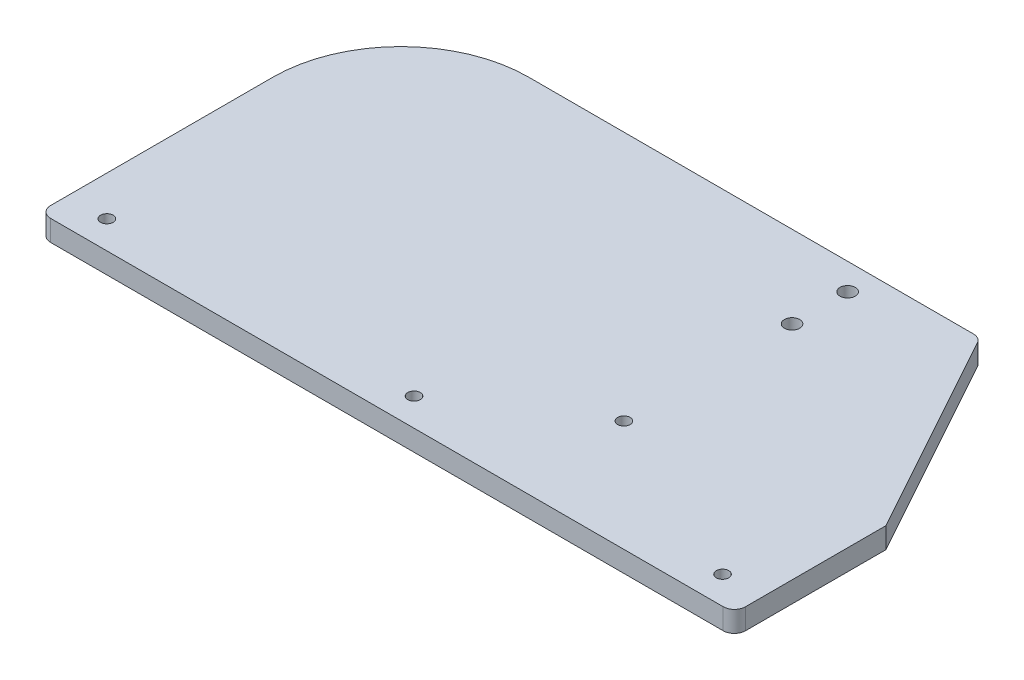
ISO-10303-21;
HEADER;
FILE_DESCRIPTION(('STEP AP214'),'2;1');
FILE_NAME('part.step','',(''),(''),'','','');
FILE_SCHEMA(('AUTOMOTIVE_DESIGN { 1 0 10303 214 1 1 1 1 }'));
ENDSEC;
DATA;
#1=APPLICATION_CONTEXT('core data for automotive mechanical design processes');
#2=APPLICATION_PROTOCOL_DEFINITION('international standard','automotive_design',2000,#1);
#3=PRODUCT_CONTEXT('',#1,'mechanical');
#4=PRODUCT('Part','Part','',(#3));
#5=PRODUCT_RELATED_PRODUCT_CATEGORY('part','',(#4));
#6=PRODUCT_DEFINITION_FORMATION('','',#4);
#7=PRODUCT_DEFINITION_CONTEXT('part definition',#1,'design');
#8=PRODUCT_DEFINITION('design','',#6,#7);
#9=PRODUCT_DEFINITION_SHAPE('','',#8);
#10=(LENGTH_UNIT() NAMED_UNIT(*) SI_UNIT(.MILLI.,.METRE.));
#11=(NAMED_UNIT(*) PLANE_ANGLE_UNIT() SI_UNIT($,.RADIAN.));
#12=(NAMED_UNIT(*) SI_UNIT($,.STERADIAN.) SOLID_ANGLE_UNIT());
#13=UNCERTAINTY_MEASURE_WITH_UNIT(LENGTH_MEASURE(1.E-05),#10,'distance_accuracy_value','');
#14=(GEOMETRIC_REPRESENTATION_CONTEXT(3) GLOBAL_UNCERTAINTY_ASSIGNED_CONTEXT((#13)) GLOBAL_UNIT_ASSIGNED_CONTEXT((#10,
#11,#12)) REPRESENTATION_CONTEXT('',''));
#15=CARTESIAN_POINT('',(0.,0.,0.));
#16=DIRECTION('',(0.,0.,1.));
#17=DIRECTION('',(1.,0.,0.));
#18=AXIS2_PLACEMENT_3D('',#15,#16,#17);
#19=CARTESIAN_POINT('',(-166.25,7.5,6.));
#20=DIRECTION('',(0.,1.,0.));
#21=DIRECTION('',(0.,0.,1.));
#22=AXIS2_PLACEMENT_3D('',#19,#20,#21);
#23=PLANE('',#22);
#24=CARTESIAN_POINT('',(0.,7.5,-110.5));
#25=DIRECTION('',(0.,1.,0.));
#26=DIRECTION('',(0.,0.,1.));
#27=AXIS2_PLACEMENT_3D('',#24,#25,#26);
#28=CIRCLE('',#27,2.75);
#29=CARTESIAN_POINT('',(0.,7.5,-107.75));
#30=VERTEX_POINT('',#29);
#31=EDGE_CURVE('E266',#30,#30,#28,.T.);
#32=ORIENTED_EDGE('',*,*,#31,.F.);
#33=EDGE_LOOP('',(#32));
#34=FACE_BOUND('',#33,.T.);
#35=CARTESIAN_POINT('',(-156.,7.5,0.));
#36=DIRECTION('',(0.,1.,0.));
#37=DIRECTION('',(0.,0.,1.));
#38=AXIS2_PLACEMENT_3D('',#35,#36,#37);
#39=CIRCLE('',#38,2.25000000000001);
#40=CARTESIAN_POINT('',(-156.,7.5,2.25000000000001));
#41=VERTEX_POINT('',#40);
#42=EDGE_CURVE('E250',#41,#41,#39,.T.);
#43=ORIENTED_EDGE('',*,*,#42,.F.);
#44=EDGE_LOOP('',(#43));
#45=FACE_BOUND('',#44,.T.);
#46=CARTESIAN_POINT('',(65.5,7.5,0.));
#47=DIRECTION('',(0.,1.,0.));
#48=DIRECTION('',(0.,0.,1.));
#49=AXIS2_PLACEMENT_3D('',#46,#47,#48);
#50=CIRCLE('',#49,2.25000000000001);
#51=CARTESIAN_POINT('',(65.5,7.5,2.25000000000001));
#52=VERTEX_POINT('',#51);
#53=EDGE_CURVE('E167',#52,#52,#50,.T.);
#54=ORIENTED_EDGE('',*,*,#53,.F.);
#55=EDGE_LOOP('',(#54));
#56=FACE_BOUND('',#55,.T.);
#57=CARTESIAN_POINT('',(-166.25,7.5,6.));
#58=DIRECTION('',(0.,1.,0.));
#59=DIRECTION('',(0.,0.,1.));
#60=AXIS2_PLACEMENT_3D('',#57,#58,#59);
#61=CIRCLE('',#60,4.);
#62=CARTESIAN_POINT('',(-170.25,7.5,6.));
#63=VERTEX_POINT('',#62);
#64=CARTESIAN_POINT('',(-166.25,7.5,10.));
#65=VERTEX_POINT('',#64);
#66=EDGE_CURVE('E187',#63,#65,#61,.T.);
#67=ORIENTED_EDGE('',*,*,#66,.T.);
#68=DIRECTION('',(1.,0.,0.));
#69=VECTOR('',#68,1.);
#70=CARTESIAN_POINT('',(-166.25,7.5,10.));
#71=LINE('',#70,#69);
#72=CARTESIAN_POINT('',(75.75,7.5,10.));
#73=VERTEX_POINT('',#72);
#74=EDGE_CURVE('E115',#65,#73,#71,.T.);
#75=ORIENTED_EDGE('',*,*,#74,.T.);
#76=CARTESIAN_POINT('',(75.75,7.5,6.));
#77=DIRECTION('',(0.,1.,0.));
#78=DIRECTION('',(0.,0.,1.));
#79=AXIS2_PLACEMENT_3D('',#76,#77,#78);
#80=CIRCLE('',#79,4.);
#81=CARTESIAN_POINT('',(79.75,7.5,6.));
#82=VERTEX_POINT('',#81);
#83=EDGE_CURVE('E210',#73,#82,#80,.T.);
#84=ORIENTED_EDGE('',*,*,#83,.T.);
#85=DIRECTION('',(0.,0.,-1.));
#86=VECTOR('',#85,1.);
#87=CARTESIAN_POINT('',(79.75,7.5,6.));
#88=LINE('',#87,#86);
#89=CARTESIAN_POINT('',(79.75,7.5,-44.5));
#90=VERTEX_POINT('',#89);
#91=EDGE_CURVE('E228',#82,#90,#88,.T.);
#92=ORIENTED_EDGE('',*,*,#91,.T.);
#93=DIRECTION('',(-0.482924771234865,0.,-0.875661844165745));
#94=VECTOR('',#93,1.);
#95=CARTESIAN_POINT('',(79.75,7.5,-44.5));
#96=LINE('',#95,#94);
#97=CARTESIAN_POINT('',(39.2526473766629,7.5,-117.931699084939));
#98=VERTEX_POINT('',#97);
#99=EDGE_CURVE('E226',#90,#98,#96,.T.);
#100=ORIENTED_EDGE('',*,*,#99,.T.);
#101=CARTESIAN_POINT('',(35.75,7.5,-116.));
#102=DIRECTION('',(0.,1.,0.));
#103=DIRECTION('',(0.,0.,1.));
#104=AXIS2_PLACEMENT_3D('',#101,#102,#103);
#105=CIRCLE('',#104,4.);
#106=CARTESIAN_POINT('',(35.75,7.5,-120.));
#107=VERTEX_POINT('',#106);
#108=EDGE_CURVE('E140',#98,#107,#105,.T.);
#109=ORIENTED_EDGE('',*,*,#108,.T.);
#110=DIRECTION('',(-1.,0.,0.));
#111=VECTOR('',#110,1.);
#112=CARTESIAN_POINT('',(35.75,7.5,-120.));
#113=LINE('',#112,#111);
#114=CARTESIAN_POINT('',(-124.25,7.5,-120.));
#115=VERTEX_POINT('',#114);
#116=EDGE_CURVE('E134',#107,#115,#113,.T.);
#117=ORIENTED_EDGE('',*,*,#116,.T.);
#118=CARTESIAN_POINT('',(-124.25,7.5,-74.));
#119=DIRECTION('',(0.,1.,0.));
#120=DIRECTION('',(0.,0.,1.));
#121=AXIS2_PLACEMENT_3D('',#118,#119,#120);
#122=CIRCLE('',#121,46.);
#123=CARTESIAN_POINT('',(-170.25,7.5,-74.));
#124=VERTEX_POINT('',#123);
#125=EDGE_CURVE('E138',#115,#124,#122,.T.);
#126=ORIENTED_EDGE('',*,*,#125,.T.);
#127=DIRECTION('',(0.,0.,1.));
#128=VECTOR('',#127,1.);
#129=CARTESIAN_POINT('',(-170.25,7.5,-74.));
#130=LINE('',#129,#128);
#131=EDGE_CURVE('E61',#124,#63,#130,.T.);
#132=ORIENTED_EDGE('',*,*,#131,.T.);
#133=EDGE_LOOP('',(#67,#75,#84,#92,#100,#109,#117,#126,#132));
#134=FACE_BOUND('',#133,.T.);
#135=CARTESIAN_POINT('',(-45.5,7.5,0.));
#136=DIRECTION('',(0.,1.,0.));
#137=DIRECTION('',(0.,0.,1.));
#138=AXIS2_PLACEMENT_3D('',#135,#136,#137);
#139=CIRCLE('',#138,2.25);
#140=CARTESIAN_POINT('',(-45.5,7.5,2.25));
#141=VERTEX_POINT('',#140);
#142=EDGE_CURVE('E242',#141,#141,#139,.T.);
#143=ORIENTED_EDGE('',*,*,#142,.F.);
#144=EDGE_LOOP('',(#143));
#145=FACE_BOUND('',#144,.T.);
#146=CARTESIAN_POINT('',(0.,7.5,-90.5));
#147=DIRECTION('',(0.,1.,0.));
#148=DIRECTION('',(0.,0.,1.));
#149=AXIS2_PLACEMENT_3D('',#146,#147,#148);
#150=CIRCLE('',#149,2.75);
#151=CARTESIAN_POINT('',(0.,7.5,-87.75));
#152=VERTEX_POINT('',#151);
#153=EDGE_CURVE('E258',#152,#152,#150,.T.);
#154=ORIENTED_EDGE('',*,*,#153,.F.);
#155=EDGE_LOOP('',(#154));
#156=FACE_BOUND('',#155,.T.);
#157=CARTESIAN_POINT('',(0.,7.5,-30.));
#158=DIRECTION('',(0.,1.,0.));
#159=DIRECTION('',(0.,0.,1.));
#160=AXIS2_PLACEMENT_3D('',#157,#158,#159);
#161=CIRCLE('',#160,2.25);
#162=CARTESIAN_POINT('',(0.,7.5,-27.75));
#163=VERTEX_POINT('',#162);
#164=EDGE_CURVE('E274',#163,#163,#161,.T.);
#165=ORIENTED_EDGE('',*,*,#164,.F.);
#166=EDGE_LOOP('',(#165));
#167=FACE_BOUND('',#166,.T.);
#168=ADVANCED_FACE('F40',(#34,#45,#56,#134,#145,#156,#167),#23,.T.);
#169=CARTESIAN_POINT('',(-166.25,0.,6.));
#170=DIRECTION('',(0.,1.,0.));
#171=DIRECTION('',(0.,0.,1.));
#172=AXIS2_PLACEMENT_3D('',#169,#170,#171);
#173=PLANE('',#172);
#174=CARTESIAN_POINT('',(-166.25,0.,6.));
#175=DIRECTION('',(0.,1.,0.));
#176=DIRECTION('',(0.,0.,1.));
#177=AXIS2_PLACEMENT_3D('',#174,#175,#176);
#178=CIRCLE('',#177,4.);
#179=CARTESIAN_POINT('',(-170.25,0.,6.));
#180=VERTEX_POINT('',#179);
#181=CARTESIAN_POINT('',(-166.25,0.,10.));
#182=VERTEX_POINT('',#181);
#183=EDGE_CURVE('E163',#180,#182,#178,.T.);
#184=ORIENTED_EDGE('',*,*,#183,.F.);
#185=DIRECTION('',(0.,0.,1.));
#186=VECTOR('',#185,1.);
#187=CARTESIAN_POINT('',(-170.25,0.,-74.));
#188=LINE('',#187,#186);
#189=CARTESIAN_POINT('',(-170.25,0.,-74.));
#190=VERTEX_POINT('',#189);
#191=EDGE_CURVE('E106',#190,#180,#188,.T.);
#192=ORIENTED_EDGE('',*,*,#191,.F.);
#193=CARTESIAN_POINT('',(-124.25,0.,-74.));
#194=DIRECTION('',(0.,1.,0.));
#195=DIRECTION('',(0.,0.,1.));
#196=AXIS2_PLACEMENT_3D('',#193,#194,#195);
#197=CIRCLE('',#196,46.);
#198=CARTESIAN_POINT('',(-124.25,0.,-120.));
#199=VERTEX_POINT('',#198);
#200=EDGE_CURVE('E99',#199,#190,#197,.T.);
#201=ORIENTED_EDGE('',*,*,#200,.F.);
#202=DIRECTION('',(-1.,0.,0.));
#203=VECTOR('',#202,1.);
#204=CARTESIAN_POINT('',(35.75,0.,-120.));
#205=LINE('',#204,#203);
#206=CARTESIAN_POINT('',(35.75,0.,-120.));
#207=VERTEX_POINT('',#206);
#208=EDGE_CURVE('E149',#207,#199,#205,.T.);
#209=ORIENTED_EDGE('',*,*,#208,.F.);
#210=CARTESIAN_POINT('',(35.75,0.,-116.));
#211=DIRECTION('',(0.,1.,0.));
#212=DIRECTION('',(0.,0.,1.));
#213=AXIS2_PLACEMENT_3D('',#210,#211,#212);
#214=CIRCLE('',#213,4.);
#215=CARTESIAN_POINT('',(39.2526473766629,0.,-117.931699084939));
#216=VERTEX_POINT('',#215);
#217=EDGE_CURVE('E178',#216,#207,#214,.T.);
#218=ORIENTED_EDGE('',*,*,#217,.F.);
#219=DIRECTION('',(-0.482924771234865,0.,-0.875661844165745));
#220=VECTOR('',#219,1.);
#221=CARTESIAN_POINT('',(79.75,0.,-44.5));
#222=LINE('',#221,#220);
#223=CARTESIAN_POINT('',(79.75,0.,-44.5));
#224=VERTEX_POINT('',#223);
#225=EDGE_CURVE('E175',#224,#216,#222,.T.);
#226=ORIENTED_EDGE('',*,*,#225,.F.);
#227=DIRECTION('',(0.,0.,-1.));
#228=VECTOR('',#227,1.);
#229=CARTESIAN_POINT('',(79.75,0.,6.));
#230=LINE('',#229,#228);
#231=CARTESIAN_POINT('',(79.75,0.,6.));
#232=VERTEX_POINT('',#231);
#233=EDGE_CURVE('E172',#232,#224,#230,.T.);
#234=ORIENTED_EDGE('',*,*,#233,.F.);
#235=CARTESIAN_POINT('',(75.75,0.,6.));
#236=DIRECTION('',(0.,1.,0.));
#237=DIRECTION('',(0.,0.,1.));
#238=AXIS2_PLACEMENT_3D('',#235,#236,#237);
#239=CIRCLE('',#238,4.);
#240=CARTESIAN_POINT('',(75.75,0.,10.));
#241=VERTEX_POINT('',#240);
#242=EDGE_CURVE('E170',#241,#232,#239,.T.);
#243=ORIENTED_EDGE('',*,*,#242,.F.);
#244=DIRECTION('',(1.,0.,0.));
#245=VECTOR('',#244,1.);
#246=CARTESIAN_POINT('',(-166.25,0.,10.));
#247=LINE('',#246,#245);
#248=EDGE_CURVE('E166',#182,#241,#247,.T.);
#249=ORIENTED_EDGE('',*,*,#248,.F.);
#250=EDGE_LOOP('',(#184,#192,#201,#209,#218,#226,#234,#243,#249));
#251=FACE_BOUND('',#250,.T.);
#252=CARTESIAN_POINT('',(65.5,0.,0.));
#253=DIRECTION('',(0.,1.,0.));
#254=DIRECTION('',(0.,0.,1.));
#255=AXIS2_PLACEMENT_3D('',#252,#253,#254);
#256=CIRCLE('',#255,2.25000000000001);
#257=CARTESIAN_POINT('',(65.5,0.,2.25000000000001));
#258=VERTEX_POINT('',#257);
#259=EDGE_CURVE('E239',#258,#258,#256,.T.);
#260=ORIENTED_EDGE('',*,*,#259,.T.);
#261=EDGE_LOOP('',(#260));
#262=FACE_BOUND('',#261,.T.);
#263=CARTESIAN_POINT('',(-45.5,0.,0.));
#264=DIRECTION('',(0.,1.,0.));
#265=DIRECTION('',(0.,0.,1.));
#266=AXIS2_PLACEMENT_3D('',#263,#264,#265);
#267=CIRCLE('',#266,2.25);
#268=CARTESIAN_POINT('',(-45.5,0.,2.25));
#269=VERTEX_POINT('',#268);
#270=EDGE_CURVE('E246',#269,#269,#267,.T.);
#271=ORIENTED_EDGE('',*,*,#270,.T.);
#272=EDGE_LOOP('',(#271));
#273=FACE_BOUND('',#272,.T.);
#274=CARTESIAN_POINT('',(-156.,0.,0.));
#275=DIRECTION('',(0.,1.,0.));
#276=DIRECTION('',(0.,0.,1.));
#277=AXIS2_PLACEMENT_3D('',#274,#275,#276);
#278=CIRCLE('',#277,2.25000000000001);
#279=CARTESIAN_POINT('',(-156.,0.,2.25000000000001));
#280=VERTEX_POINT('',#279);
#281=EDGE_CURVE('E254',#280,#280,#278,.T.);
#282=ORIENTED_EDGE('',*,*,#281,.T.);
#283=EDGE_LOOP('',(#282));
#284=FACE_BOUND('',#283,.T.);
#285=CARTESIAN_POINT('',(0.,0.,-90.5));
#286=DIRECTION('',(0.,1.,0.));
#287=DIRECTION('',(0.,0.,1.));
#288=AXIS2_PLACEMENT_3D('',#285,#286,#287);
#289=CIRCLE('',#288,2.75);
#290=CARTESIAN_POINT('',(0.,0.,-87.75));
#291=VERTEX_POINT('',#290);
#292=EDGE_CURVE('E262',#291,#291,#289,.T.);
#293=ORIENTED_EDGE('',*,*,#292,.T.);
#294=EDGE_LOOP('',(#293));
#295=FACE_BOUND('',#294,.T.);
#296=CARTESIAN_POINT('',(0.,0.,-110.5));
#297=DIRECTION('',(0.,1.,0.));
#298=DIRECTION('',(0.,0.,1.));
#299=AXIS2_PLACEMENT_3D('',#296,#297,#298);
#300=CIRCLE('',#299,2.75);
#301=CARTESIAN_POINT('',(0.,0.,-107.75));
#302=VERTEX_POINT('',#301);
#303=EDGE_CURVE('E270',#302,#302,#300,.T.);
#304=ORIENTED_EDGE('',*,*,#303,.T.);
#305=EDGE_LOOP('',(#304));
#306=FACE_BOUND('',#305,.T.);
#307=CARTESIAN_POINT('',(0.,0.,-30.));
#308=DIRECTION('',(0.,1.,0.));
#309=DIRECTION('',(0.,0.,1.));
#310=AXIS2_PLACEMENT_3D('',#307,#308,#309);
#311=CIRCLE('',#310,2.25);
#312=CARTESIAN_POINT('',(0.,0.,-27.75));
#313=VERTEX_POINT('',#312);
#314=EDGE_CURVE('E278',#313,#313,#311,.T.);
#315=ORIENTED_EDGE('',*,*,#314,.T.);
#316=EDGE_LOOP('',(#315));
#317=FACE_BOUND('',#316,.T.);
#318=ADVANCED_FACE('F214',(#251,#262,#273,#284,#295,#306,#317),#173,.F.);
#319=CARTESIAN_POINT('',(-166.25,7.5,6.));
#320=DIRECTION('',(0.,-1.,0.));
#321=DIRECTION('',(0.,0.,-1.));
#322=AXIS2_PLACEMENT_3D('',#319,#320,#321);
#323=CYLINDRICAL_SURFACE('',#322,4.);
#324=ORIENTED_EDGE('',*,*,#183,.T.);
#325=DIRECTION('',(0.,-1.,0.));
#326=VECTOR('',#325,1.);
#327=CARTESIAN_POINT('',(-166.25,7.5,10.));
#328=LINE('',#327,#326);
#329=EDGE_CURVE('E11',#65,#182,#328,.T.);
#330=ORIENTED_EDGE('',*,*,#329,.F.);
#331=ORIENTED_EDGE('',*,*,#66,.F.);
#332=DIRECTION('',(0.,-1.,0.));
#333=VECTOR('',#332,1.);
#334=CARTESIAN_POINT('',(-170.25,7.5,6.));
#335=LINE('',#334,#333);
#336=EDGE_CURVE('E159',#63,#180,#335,.T.);
#337=ORIENTED_EDGE('',*,*,#336,.T.);
#338=EDGE_LOOP('',(#324,#330,#331,#337));
#339=FACE_BOUND('',#338,.T.);
#340=ADVANCED_FACE('F42',(#339),#323,.T.);
#341=CARTESIAN_POINT('',(-166.25,7.5,10.));
#342=DIRECTION('',(0.,0.,-1.));
#343=DIRECTION('',(-1.,0.,0.));
#344=AXIS2_PLACEMENT_3D('',#341,#342,#343);
#345=PLANE('',#344);
#346=ORIENTED_EDGE('',*,*,#248,.T.);
#347=DIRECTION('',(0.,-1.,0.));
#348=VECTOR('',#347,1.);
#349=CARTESIAN_POINT('',(75.75,7.5,10.));
#350=LINE('',#349,#348);
#351=EDGE_CURVE('E50',#73,#241,#350,.T.);
#352=ORIENTED_EDGE('',*,*,#351,.F.);
#353=ORIENTED_EDGE('',*,*,#74,.F.);
#354=ORIENTED_EDGE('',*,*,#329,.T.);
#355=EDGE_LOOP('',(#346,#352,#353,#354));
#356=FACE_BOUND('',#355,.T.);
#357=ADVANCED_FACE('F318',(#356),#345,.F.);
#358=CARTESIAN_POINT('',(75.75,7.5,6.));
#359=DIRECTION('',(0.,-1.,0.));
#360=DIRECTION('',(0.,0.,-1.));
#361=AXIS2_PLACEMENT_3D('',#358,#359,#360);
#362=CYLINDRICAL_SURFACE('',#361,4.);
#363=ORIENTED_EDGE('',*,*,#242,.T.);
#364=DIRECTION('',(0.,-1.,0.));
#365=VECTOR('',#364,1.);
#366=CARTESIAN_POINT('',(79.75,7.5,6.));
#367=LINE('',#366,#365);
#368=EDGE_CURVE('E202',#82,#232,#367,.T.);
#369=ORIENTED_EDGE('',*,*,#368,.F.);
#370=ORIENTED_EDGE('',*,*,#83,.F.);
#371=ORIENTED_EDGE('',*,*,#351,.T.);
#372=EDGE_LOOP('',(#363,#369,#370,#371));
#373=FACE_BOUND('',#372,.T.);
#374=ADVANCED_FACE('F208',(#373),#362,.T.);
#375=CARTESIAN_POINT('',(79.75,7.5,6.));
#376=DIRECTION('',(-1.,0.,0.));
#377=DIRECTION('',(0.,0.,1.));
#378=AXIS2_PLACEMENT_3D('',#375,#376,#377);
#379=PLANE('',#378);
#380=ORIENTED_EDGE('',*,*,#233,.T.);
#381=DIRECTION('',(0.,-1.,0.));
#382=VECTOR('',#381,1.);
#383=CARTESIAN_POINT('',(79.75,7.5,-44.5));
#384=LINE('',#383,#382);
#385=EDGE_CURVE('E198',#90,#224,#384,.T.);
#386=ORIENTED_EDGE('',*,*,#385,.F.);
#387=ORIENTED_EDGE('',*,*,#91,.F.);
#388=ORIENTED_EDGE('',*,*,#368,.T.);
#389=EDGE_LOOP('',(#380,#386,#387,#388));
#390=FACE_BOUND('',#389,.T.);
#391=ADVANCED_FACE('F220',(#390),#379,.F.);
#392=CARTESIAN_POINT('',(79.75,7.5,-44.5));
#393=DIRECTION('',(-0.875661844165745,0.,0.482924771234864));
#394=DIRECTION('',(0.482924771234865,0.,0.875661844165745));
#395=AXIS2_PLACEMENT_3D('',#392,#393,#394);
#396=PLANE('',#395);
#397=ORIENTED_EDGE('',*,*,#225,.T.);
#398=DIRECTION('',(0.,-1.,0.));
#399=VECTOR('',#398,1.);
#400=CARTESIAN_POINT('',(39.2526473766629,7.5,-117.931699084939));
#401=LINE('',#400,#399);
#402=EDGE_CURVE('E194',#98,#216,#401,.T.);
#403=ORIENTED_EDGE('',*,*,#402,.F.);
#404=ORIENTED_EDGE('',*,*,#99,.F.);
#405=ORIENTED_EDGE('',*,*,#385,.T.);
#406=EDGE_LOOP('',(#397,#403,#404,#405));
#407=FACE_BOUND('',#406,.T.);
#408=ADVANCED_FACE('F224',(#407),#396,.F.);
#409=CARTESIAN_POINT('',(35.75,7.5,-116.));
#410=DIRECTION('',(0.,-1.,0.));
#411=DIRECTION('',(0.,0.,-1.));
#412=AXIS2_PLACEMENT_3D('',#409,#410,#411);
#413=CYLINDRICAL_SURFACE('',#412,4.);
#414=ORIENTED_EDGE('',*,*,#217,.T.);
#415=DIRECTION('',(0.,-1.,0.));
#416=VECTOR('',#415,1.);
#417=CARTESIAN_POINT('',(35.75,7.5,-120.));
#418=LINE('',#417,#416);
#419=EDGE_CURVE('E151',#107,#207,#418,.T.);
#420=ORIENTED_EDGE('',*,*,#419,.F.);
#421=ORIENTED_EDGE('',*,*,#108,.F.);
#422=ORIENTED_EDGE('',*,*,#402,.T.);
#423=EDGE_LOOP('',(#414,#420,#421,#422));
#424=FACE_BOUND('',#423,.T.);
#425=ADVANCED_FACE('F309',(#424),#413,.T.);
#426=CARTESIAN_POINT('',(35.75,7.5,-120.));
#427=DIRECTION('',(0.,0.,1.));
#428=DIRECTION('',(1.,0.,0.));
#429=AXIS2_PLACEMENT_3D('',#426,#427,#428);
#430=PLANE('',#429);
#431=ORIENTED_EDGE('',*,*,#208,.T.);
#432=DIRECTION('',(0.,-1.,0.));
#433=VECTOR('',#432,1.);
#434=CARTESIAN_POINT('',(-124.25,7.5,-120.));
#435=LINE('',#434,#433);
#436=EDGE_CURVE('E146',#115,#199,#435,.T.);
#437=ORIENTED_EDGE('',*,*,#436,.F.);
#438=ORIENTED_EDGE('',*,*,#116,.F.);
#439=ORIENTED_EDGE('',*,*,#419,.T.);
#440=EDGE_LOOP('',(#431,#437,#438,#439));
#441=FACE_BOUND('',#440,.T.);
#442=ADVANCED_FACE('F147',(#441),#430,.F.);
#443=CARTESIAN_POINT('',(-124.25,7.5,-74.));
#444=DIRECTION('',(0.,-1.,0.));
#445=DIRECTION('',(0.,0.,-1.));
#446=AXIS2_PLACEMENT_3D('',#443,#444,#445);
#447=CYLINDRICAL_SURFACE('',#446,46.);
#448=ORIENTED_EDGE('',*,*,#200,.T.);
#449=DIRECTION('',(0.,-1.,0.));
#450=VECTOR('',#449,1.);
#451=CARTESIAN_POINT('',(-170.25,7.5,-74.));
#452=LINE('',#451,#450);
#453=EDGE_CURVE('E152',#124,#190,#452,.T.);
#454=ORIENTED_EDGE('',*,*,#453,.F.);
#455=ORIENTED_EDGE('',*,*,#125,.F.);
#456=ORIENTED_EDGE('',*,*,#436,.T.);
#457=EDGE_LOOP('',(#448,#454,#455,#456));
#458=FACE_BOUND('',#457,.T.);
#459=ADVANCED_FACE('F154',(#458),#447,.T.);
#460=CARTESIAN_POINT('',(-170.25,7.5,-74.));
#461=DIRECTION('',(1.,0.,0.));
#462=DIRECTION('',(0.,0.,-1.));
#463=AXIS2_PLACEMENT_3D('',#460,#461,#462);
#464=PLANE('',#463);
#465=ORIENTED_EDGE('',*,*,#191,.T.);
#466=ORIENTED_EDGE('',*,*,#336,.F.);
#467=ORIENTED_EDGE('',*,*,#131,.F.);
#468=ORIENTED_EDGE('',*,*,#453,.T.);
#469=EDGE_LOOP('',(#465,#466,#467,#468));
#470=FACE_BOUND('',#469,.T.);
#471=ADVANCED_FACE('F302',(#470),#464,.F.);
#472=CARTESIAN_POINT('',(65.5,7.5,0.));
#473=DIRECTION('',(0.,-1.,0.));
#474=DIRECTION('',(0.,0.,-1.));
#475=AXIS2_PLACEMENT_3D('',#472,#473,#474);
#476=CYLINDRICAL_SURFACE('',#475,2.25000000000001);
#477=ORIENTED_EDGE('',*,*,#53,.T.);
#478=EDGE_LOOP('',(#477));
#479=FACE_BOUND('',#478,.T.);
#480=ORIENTED_EDGE('',*,*,#259,.F.);
#481=EDGE_LOOP('',(#480));
#482=FACE_BOUND('',#481,.T.);
#483=ADVANCED_FACE('F299',(#479,#482),#476,.F.);
#484=CARTESIAN_POINT('',(-45.5,7.5,0.));
#485=DIRECTION('',(0.,-1.,0.));
#486=DIRECTION('',(0.,0.,-1.));
#487=AXIS2_PLACEMENT_3D('',#484,#485,#486);
#488=CYLINDRICAL_SURFACE('',#487,2.25);
#489=ORIENTED_EDGE('',*,*,#142,.T.);
#490=EDGE_LOOP('',(#489));
#491=FACE_BOUND('',#490,.T.);
#492=ORIENTED_EDGE('',*,*,#270,.F.);
#493=EDGE_LOOP('',(#492));
#494=FACE_BOUND('',#493,.T.);
#495=ADVANCED_FACE('F364',(#491,#494),#488,.F.);
#496=CARTESIAN_POINT('',(-156.,7.5,0.));
#497=DIRECTION('',(0.,-1.,0.));
#498=DIRECTION('',(0.,0.,-1.));
#499=AXIS2_PLACEMENT_3D('',#496,#497,#498);
#500=CYLINDRICAL_SURFACE('',#499,2.25000000000001);
#501=ORIENTED_EDGE('',*,*,#42,.T.);
#502=EDGE_LOOP('',(#501));
#503=FACE_BOUND('',#502,.T.);
#504=ORIENTED_EDGE('',*,*,#281,.F.);
#505=EDGE_LOOP('',(#504));
#506=FACE_BOUND('',#505,.T.);
#507=ADVANCED_FACE('F371',(#503,#506),#500,.F.);
#508=CARTESIAN_POINT('',(0.,7.5,-90.5));
#509=DIRECTION('',(0.,-1.,0.));
#510=DIRECTION('',(0.,0.,-1.));
#511=AXIS2_PLACEMENT_3D('',#508,#509,#510);
#512=CYLINDRICAL_SURFACE('',#511,2.75);
#513=ORIENTED_EDGE('',*,*,#153,.T.);
#514=EDGE_LOOP('',(#513));
#515=FACE_BOUND('',#514,.T.);
#516=ORIENTED_EDGE('',*,*,#292,.F.);
#517=EDGE_LOOP('',(#516));
#518=FACE_BOUND('',#517,.T.);
#519=ADVANCED_FACE('F378',(#515,#518),#512,.F.);
#520=CARTESIAN_POINT('',(0.,7.5,-110.5));
#521=DIRECTION('',(0.,-1.,0.));
#522=DIRECTION('',(0.,0.,-1.));
#523=AXIS2_PLACEMENT_3D('',#520,#521,#522);
#524=CYLINDRICAL_SURFACE('',#523,2.75);
#525=ORIENTED_EDGE('',*,*,#31,.T.);
#526=EDGE_LOOP('',(#525));
#527=FACE_BOUND('',#526,.T.);
#528=ORIENTED_EDGE('',*,*,#303,.F.);
#529=EDGE_LOOP('',(#528));
#530=FACE_BOUND('',#529,.T.);
#531=ADVANCED_FACE('F386',(#527,#530),#524,.F.);
#532=CARTESIAN_POINT('',(0.,7.5,-30.));
#533=DIRECTION('',(0.,-1.,0.));
#534=DIRECTION('',(0.,0.,-1.));
#535=AXIS2_PLACEMENT_3D('',#532,#533,#534);
#536=CYLINDRICAL_SURFACE('',#535,2.25);
#537=ORIENTED_EDGE('',*,*,#164,.T.);
#538=EDGE_LOOP('',(#537));
#539=FACE_BOUND('',#538,.T.);
#540=ORIENTED_EDGE('',*,*,#314,.F.);
#541=EDGE_LOOP('',(#540));
#542=FACE_BOUND('',#541,.T.);
#543=ADVANCED_FACE('F286',(#539,#542),#536,.F.);
#544=CLOSED_SHELL('',(#168,#318,#340,#357,#374,#391,#408,#425,#442,#459,#471,#483,#495,#507,
#519,#531,#543));
#545=MANIFOLD_SOLID_BREP('B2',#544);
#546=ADVANCED_BREP_SHAPE_REPRESENTATION('',(#18,#545),#14);
#547=SHAPE_DEFINITION_REPRESENTATION(#9,#546);
ENDSEC;
END-ISO-10303-21;
